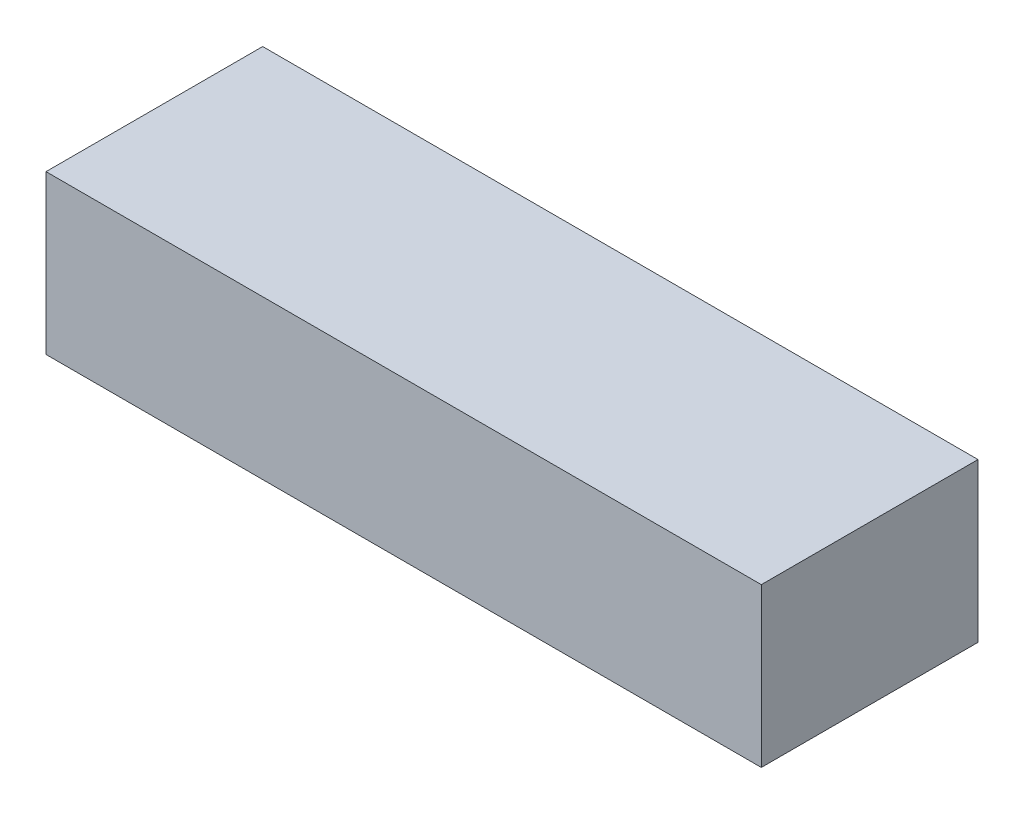
ISO-10303-21;
HEADER;
FILE_DESCRIPTION(('STEP AP214'),'2;1');
FILE_NAME('part.step','',(''),(''),'','','');
FILE_SCHEMA(('AUTOMOTIVE_DESIGN { 1 0 10303 214 1 1 1 1 }'));
ENDSEC;
DATA;
#1=APPLICATION_CONTEXT('core data for automotive mechanical design processes');
#2=APPLICATION_PROTOCOL_DEFINITION('international standard','automotive_design',2000,#1);
#3=PRODUCT_CONTEXT('',#1,'mechanical');
#4=PRODUCT('Part','Part','',(#3));
#5=PRODUCT_RELATED_PRODUCT_CATEGORY('part','',(#4));
#6=PRODUCT_DEFINITION_FORMATION('','',#4);
#7=PRODUCT_DEFINITION_CONTEXT('part definition',#1,'design');
#8=PRODUCT_DEFINITION('design','',#6,#7);
#9=PRODUCT_DEFINITION_SHAPE('','',#8);
#10=(LENGTH_UNIT() NAMED_UNIT(*) SI_UNIT(.MILLI.,.METRE.));
#11=(NAMED_UNIT(*) PLANE_ANGLE_UNIT() SI_UNIT($,.RADIAN.));
#12=(NAMED_UNIT(*) SI_UNIT($,.STERADIAN.) SOLID_ANGLE_UNIT());
#13=UNCERTAINTY_MEASURE_WITH_UNIT(LENGTH_MEASURE(1.E-05),#10,'distance_accuracy_value','');
#14=(GEOMETRIC_REPRESENTATION_CONTEXT(3) GLOBAL_UNCERTAINTY_ASSIGNED_CONTEXT((#13)) GLOBAL_UNIT_ASSIGNED_CONTEXT((#10,
#11,#12)) REPRESENTATION_CONTEXT('',''));
#15=CARTESIAN_POINT('',(0.,0.,0.));
#16=DIRECTION('',(0.,0.,1.));
#17=DIRECTION('',(1.,0.,0.));
#18=AXIS2_PLACEMENT_3D('',#15,#16,#17);
#19=CARTESIAN_POINT('',(5.02965724624715E-09,18.9999999949705,0.));
#20=DIRECTION('',(0.,0.,-1.));
#21=DIRECTION('',(0.,1.,0.));
#22=AXIS2_PLACEMENT_3D('',#19,#20,#21);
#23=PLANE('',#22);
#24=DIRECTION('',(0.,1.,0.));
#25=VECTOR('',#24,1.);
#26=CARTESIAN_POINT('',(85.8323720749976,18.9999999949704,0.));
#27=LINE('',#26,#25);
#28=CARTESIAN_POINT('',(85.8323720749976,-5.02963642956544E-09,0.));
#29=VERTEX_POINT('',#28);
#30=CARTESIAN_POINT('',(85.8323720749976,18.9999999949704,0.));
#31=VERTEX_POINT('',#30);
#32=EDGE_CURVE('E100',#29,#31,#27,.T.);
#33=ORIENTED_EDGE('',*,*,#32,.F.);
#34=DIRECTION('',(1.,0.,0.));
#35=VECTOR('',#34,1.);
#36=CARTESIAN_POINT('',(85.8323720749976,-5.02963642956544E-09,0.));
#37=LINE('',#36,#35);
#38=CARTESIAN_POINT('',(5.00231800426576E-09,-5.02963642956544E-09,0.));
#39=VERTEX_POINT('',#38);
#40=EDGE_CURVE('E105',#39,#29,#37,.T.);
#41=ORIENTED_EDGE('',*,*,#40,.F.);
#42=DIRECTION('',(0.,-1.,0.));
#43=VECTOR('',#42,1.);
#44=CARTESIAN_POINT('',(5.00231800426576E-09,-5.02963642956544E-09,0.));
#45=LINE('',#44,#43);
#46=CARTESIAN_POINT('',(5.00231800426576E-09,18.9999999949704,0.));
#47=VERTEX_POINT('',#46);
#48=EDGE_CURVE('E103',#47,#39,#45,.T.);
#49=ORIENTED_EDGE('',*,*,#48,.F.);
#50=DIRECTION('',(-1.,0.,0.));
#51=VECTOR('',#50,1.);
#52=CARTESIAN_POINT('',(5.00231800426576E-09,18.9999999949704,0.));
#53=LINE('',#52,#51);
#54=EDGE_CURVE('E82',#31,#47,#53,.T.);
#55=ORIENTED_EDGE('',*,*,#54,.F.);
#56=EDGE_LOOP('',(#33,#41,#49,#55));
#57=FACE_BOUND('',#56,.T.);
#58=ADVANCED_FACE('F36',(#57),#23,.T.);
#59=CARTESIAN_POINT('',(85.8323720749976,-5.02963642956544E-09,4.99999999502961));
#60=DIRECTION('',(1.,0.,0.));
#61=DIRECTION('',(0.,1.,0.));
#62=AXIS2_PLACEMENT_3D('',#59,#60,#61);
#63=PLANE('',#62);
#64=DIRECTION('',(0.,0.,-1.));
#65=VECTOR('',#64,1.);
#66=CARTESIAN_POINT('',(85.8323720749976,18.9999999949704,4.99999999502968));
#67=LINE('',#66,#65);
#68=CARTESIAN_POINT('',(85.8323720749976,18.9999999949704,26.));
#69=VERTEX_POINT('',#68);
#70=EDGE_CURVE('E11',#69,#31,#67,.T.);
#71=ORIENTED_EDGE('',*,*,#70,.F.);
#72=DIRECTION('',(0.,1.,0.));
#73=VECTOR('',#72,1.);
#74=CARTESIAN_POINT('',(85.8323720749976,18.9999999949704,26.));
#75=LINE('',#74,#73);
#76=CARTESIAN_POINT('',(85.8323720749976,-5.02963642956544E-09,26.));
#77=VERTEX_POINT('',#76);
#78=EDGE_CURVE('E93',#77,#69,#75,.T.);
#79=ORIENTED_EDGE('',*,*,#78,.F.);
#80=DIRECTION('',(0.,0.,-1.));
#81=VECTOR('',#80,1.);
#82=CARTESIAN_POINT('',(85.8323720749976,-5.02963642956544E-09,4.99999999502961));
#83=LINE('',#82,#81);
#84=EDGE_CURVE('E45',#77,#29,#83,.T.);
#85=ORIENTED_EDGE('',*,*,#84,.T.);
#86=ORIENTED_EDGE('',*,*,#32,.T.);
#87=EDGE_LOOP('',(#71,#79,#85,#86));
#88=FACE_BOUND('',#87,.T.);
#89=ADVANCED_FACE('F110',(#88),#63,.T.);
#90=CARTESIAN_POINT('',(20.91618604,-5.02963642956544E-09,4.99999999502961));
#91=DIRECTION('',(0.,-1.,0.));
#92=DIRECTION('',(1.,0.,0.));
#93=AXIS2_PLACEMENT_3D('',#90,#91,#92);
#94=PLANE('',#93);
#95=ORIENTED_EDGE('',*,*,#40,.T.);
#96=ORIENTED_EDGE('',*,*,#84,.F.);
#97=DIRECTION('',(1.,0.,0.));
#98=VECTOR('',#97,1.);
#99=CARTESIAN_POINT('',(16.8897912138371,-5.02963642956544E-09,26.));
#100=LINE('',#99,#98);
#101=CARTESIAN_POINT('',(5.00231800426576E-09,-5.02963642956544E-09,26.));
#102=VERTEX_POINT('',#101);
#103=EDGE_CURVE('E87',#102,#77,#100,.T.);
#104=ORIENTED_EDGE('',*,*,#103,.F.);
#105=DIRECTION('',(0.,0.,-1.));
#106=VECTOR('',#105,1.);
#107=CARTESIAN_POINT('',(5.00231800426576E-09,-5.02963642956544E-09,4.99999999502961));
#108=LINE('',#107,#106);
#109=EDGE_CURVE('E65',#102,#39,#108,.T.);
#110=ORIENTED_EDGE('',*,*,#109,.T.);
#111=EDGE_LOOP('',(#95,#96,#104,#110));
#112=FACE_BOUND('',#111,.T.);
#113=ADVANCED_FACE('F108',(#112),#94,.T.);
#114=CARTESIAN_POINT('',(5.00231800426576E-09,-5.02963642956544E-09,4.99999999502961));
#115=DIRECTION('',(1.,0.,0.));
#116=DIRECTION('',(0.,1.,0.));
#117=AXIS2_PLACEMENT_3D('',#114,#115,#116);
#118=PLANE('',#117);
#119=ORIENTED_EDGE('',*,*,#109,.F.);
#120=DIRECTION('',(0.,-1.,0.));
#121=VECTOR('',#120,1.);
#122=CARTESIAN_POINT('',(5.00231800426576E-09,-5.02963642956544E-09,26.));
#123=LINE('',#122,#121);
#124=CARTESIAN_POINT('',(5.00231800426576E-09,18.9999999949704,26.));
#125=VERTEX_POINT('',#124);
#126=EDGE_CURVE('E92',#125,#102,#123,.T.);
#127=ORIENTED_EDGE('',*,*,#126,.F.);
#128=DIRECTION('',(0.,0.,-1.));
#129=VECTOR('',#128,1.);
#130=CARTESIAN_POINT('',(5.00231800426576E-09,18.9999999949704,4.99999999502968));
#131=LINE('',#130,#129);
#132=EDGE_CURVE('E77',#125,#47,#131,.T.);
#133=ORIENTED_EDGE('',*,*,#132,.T.);
#134=ORIENTED_EDGE('',*,*,#48,.T.);
#135=EDGE_LOOP('',(#119,#127,#133,#134));
#136=FACE_BOUND('',#135,.T.);
#137=ADVANCED_FACE('F95',(#136),#118,.F.);
#138=CARTESIAN_POINT('',(68.9425808661629,18.9999999949703,10.9999999950296));
#139=DIRECTION('',(0.,-1.,0.));
#140=DIRECTION('',(1.,0.,0.));
#141=AXIS2_PLACEMENT_3D('',#138,#139,#140);
#142=PLANE('',#141);
#143=ORIENTED_EDGE('',*,*,#70,.T.);
#144=ORIENTED_EDGE('',*,*,#54,.T.);
#145=ORIENTED_EDGE('',*,*,#132,.F.);
#146=DIRECTION('',(-1.,0.,0.));
#147=VECTOR('',#146,1.);
#148=CARTESIAN_POINT('',(68.9425808661629,18.9999999949704,26.));
#149=LINE('',#148,#147);
#150=EDGE_CURVE('E79',#69,#125,#149,.T.);
#151=ORIENTED_EDGE('',*,*,#150,.F.);
#152=EDGE_LOOP('',(#143,#144,#145,#151));
#153=FACE_BOUND('',#152,.T.);
#154=ADVANCED_FACE('F38',(#153),#142,.F.);
#155=CARTESIAN_POINT('',(5.02965724624715E-09,18.9999999949705,26.));
#156=DIRECTION('',(0.,0.,-1.));
#157=DIRECTION('',(0.,1.,0.));
#158=AXIS2_PLACEMENT_3D('',#155,#156,#157);
#159=PLANE('',#158);
#160=ORIENTED_EDGE('',*,*,#78,.T.);
#161=ORIENTED_EDGE('',*,*,#150,.T.);
#162=ORIENTED_EDGE('',*,*,#126,.T.);
#163=ORIENTED_EDGE('',*,*,#103,.T.);
#164=EDGE_LOOP('',(#160,#161,#162,#163));
#165=FACE_BOUND('',#164,.T.);
#166=ADVANCED_FACE('F91',(#165),#159,.F.);
#167=CLOSED_SHELL('',(#58,#89,#113,#137,#154,#166));
#168=MANIFOLD_SOLID_BREP('B2',#167);
#169=ADVANCED_BREP_SHAPE_REPRESENTATION('',(#18,#168),#14);
#170=SHAPE_DEFINITION_REPRESENTATION(#9,#169);
ENDSEC;
END-ISO-10303-21;
